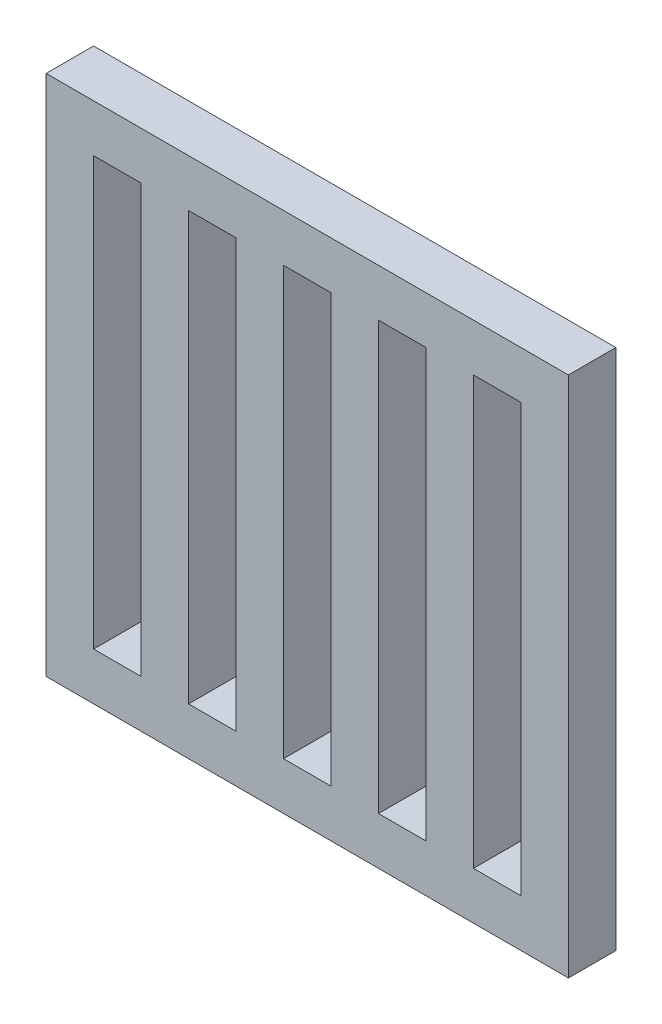
ISO-10303-21;
HEADER;
FILE_DESCRIPTION(('STEP AP214'),'2;1');
FILE_NAME('part.step','',(''),(''),'','','');
FILE_SCHEMA(('AUTOMOTIVE_DESIGN { 1 0 10303 214 1 1 1 1 }'));
ENDSEC;
DATA;
#1=APPLICATION_CONTEXT('core data for automotive mechanical design processes');
#2=APPLICATION_PROTOCOL_DEFINITION('international standard','automotive_design',2000,#1);
#3=PRODUCT_CONTEXT('',#1,'mechanical');
#4=PRODUCT('Part','Part','',(#3));
#5=PRODUCT_RELATED_PRODUCT_CATEGORY('part','',(#4));
#6=PRODUCT_DEFINITION_FORMATION('','',#4);
#7=PRODUCT_DEFINITION_CONTEXT('part definition',#1,'design');
#8=PRODUCT_DEFINITION('design','',#6,#7);
#9=PRODUCT_DEFINITION_SHAPE('','',#8);
#10=(LENGTH_UNIT() NAMED_UNIT(*) SI_UNIT(.MILLI.,.METRE.));
#11=(NAMED_UNIT(*) PLANE_ANGLE_UNIT() SI_UNIT($,.RADIAN.));
#12=(NAMED_UNIT(*) SI_UNIT($,.STERADIAN.) SOLID_ANGLE_UNIT());
#13=UNCERTAINTY_MEASURE_WITH_UNIT(LENGTH_MEASURE(1.E-05),#10,'distance_accuracy_value','');
#14=(GEOMETRIC_REPRESENTATION_CONTEXT(3) GLOBAL_UNCERTAINTY_ASSIGNED_CONTEXT((#13)) GLOBAL_UNIT_ASSIGNED_CONTEXT((#10,
#11,#12)) REPRESENTATION_CONTEXT('',''));
#15=CARTESIAN_POINT('',(0.,0.,0.));
#16=DIRECTION('',(0.,0.,1.));
#17=DIRECTION('',(1.,0.,0.));
#18=AXIS2_PLACEMENT_3D('',#15,#16,#17);
#19=CARTESIAN_POINT('',(0.,0.,50.));
#20=DIRECTION('',(1.,0.,0.));
#21=DIRECTION('',(0.,1.,0.));
#22=AXIS2_PLACEMENT_3D('',#19,#20,#21);
#23=PLANE('',#22);
#24=DIRECTION('',(0.,-1.,0.));
#25=VECTOR('',#24,1.);
#26=CARTESIAN_POINT('',(0.,0.,0.));
#27=LINE('',#26,#25);
#28=CARTESIAN_POINT('',(0.,0.,0.));
#29=VERTEX_POINT('',#28);
#30=CARTESIAN_POINT('',(0.,-550.,0.));
#31=VERTEX_POINT('',#30);
#32=EDGE_CURVE('E233',#29,#31,#27,.T.);
#33=ORIENTED_EDGE('',*,*,#32,.T.);
#34=DIRECTION('',(0.,0.,-1.));
#35=VECTOR('',#34,1.);
#36=CARTESIAN_POINT('',(0.,-550.,50.));
#37=LINE('',#36,#35);
#38=CARTESIAN_POINT('',(0.,-550.,50.));
#39=VERTEX_POINT('',#38);
#40=EDGE_CURVE('E11',#39,#31,#37,.T.);
#41=ORIENTED_EDGE('',*,*,#40,.F.);
#42=DIRECTION('',(0.,-1.,0.));
#43=VECTOR('',#42,1.);
#44=CARTESIAN_POINT('',(0.,0.,50.));
#45=LINE('',#44,#43);
#46=CARTESIAN_POINT('',(0.,0.,50.));
#47=VERTEX_POINT('',#46);
#48=EDGE_CURVE('E362',#47,#39,#45,.T.);
#49=ORIENTED_EDGE('',*,*,#48,.F.);
#50=DIRECTION('',(0.,0.,-1.));
#51=VECTOR('',#50,1.);
#52=CARTESIAN_POINT('',(0.,0.,50.));
#53=LINE('',#52,#51);
#54=EDGE_CURVE('E372',#47,#29,#53,.T.);
#55=ORIENTED_EDGE('',*,*,#54,.T.);
#56=EDGE_LOOP('',(#33,#41,#49,#55));
#57=FACE_BOUND('',#56,.T.);
#58=ADVANCED_FACE('F36',(#57),#23,.F.);
#59=CARTESIAN_POINT('',(0.,-550.,50.));
#60=DIRECTION('',(0.,1.,0.));
#61=DIRECTION('',(-1.,0.,0.));
#62=AXIS2_PLACEMENT_3D('',#59,#60,#61);
#63=PLANE('',#62);
#64=DIRECTION('',(1.,0.,0.));
#65=VECTOR('',#64,1.);
#66=CARTESIAN_POINT('',(0.,-550.,0.));
#67=LINE('',#66,#65);
#68=CARTESIAN_POINT('',(550.,-550.,0.));
#69=VERTEX_POINT('',#68);
#70=EDGE_CURVE('E375',#31,#69,#67,.T.);
#71=ORIENTED_EDGE('',*,*,#70,.T.);
#72=DIRECTION('',(0.,0.,-1.));
#73=VECTOR('',#72,1.);
#74=CARTESIAN_POINT('',(550.,-550.,50.));
#75=LINE('',#74,#73);
#76=CARTESIAN_POINT('',(550.,-550.,50.));
#77=VERTEX_POINT('',#76);
#78=EDGE_CURVE('E43',#77,#69,#75,.T.);
#79=ORIENTED_EDGE('',*,*,#78,.F.);
#80=DIRECTION('',(1.,0.,0.));
#81=VECTOR('',#80,1.);
#82=CARTESIAN_POINT('',(0.,-550.,50.));
#83=LINE('',#82,#81);
#84=EDGE_CURVE('E365',#39,#77,#83,.T.);
#85=ORIENTED_EDGE('',*,*,#84,.F.);
#86=ORIENTED_EDGE('',*,*,#40,.T.);
#87=EDGE_LOOP('',(#71,#79,#85,#86));
#88=FACE_BOUND('',#87,.T.);
#89=ADVANCED_FACE('F404',(#88),#63,.F.);
#90=CARTESIAN_POINT('',(550.,0.,50.));
#91=DIRECTION('',(-1.,0.,0.));
#92=DIRECTION('',(0.,-1.,0.));
#93=AXIS2_PLACEMENT_3D('',#90,#91,#92);
#94=PLANE('',#93);
#95=DIRECTION('',(0.,1.,0.));
#96=VECTOR('',#95,1.);
#97=CARTESIAN_POINT('',(550.,0.,0.));
#98=LINE('',#97,#96);
#99=CARTESIAN_POINT('',(550.,0.,0.));
#100=VERTEX_POINT('',#99);
#101=EDGE_CURVE('E377',#69,#100,#98,.T.);
#102=ORIENTED_EDGE('',*,*,#101,.T.);
#103=DIRECTION('',(0.,0.,-1.));
#104=VECTOR('',#103,1.);
#105=CARTESIAN_POINT('',(550.,0.,50.));
#106=LINE('',#105,#104);
#107=CARTESIAN_POINT('',(550.,0.,50.));
#108=VERTEX_POINT('',#107);
#109=EDGE_CURVE('E382',#108,#100,#106,.T.);
#110=ORIENTED_EDGE('',*,*,#109,.F.);
#111=DIRECTION('',(0.,1.,0.));
#112=VECTOR('',#111,1.);
#113=CARTESIAN_POINT('',(550.,0.,50.));
#114=LINE('',#113,#112);
#115=EDGE_CURVE('E368',#77,#108,#114,.T.);
#116=ORIENTED_EDGE('',*,*,#115,.F.);
#117=ORIENTED_EDGE('',*,*,#78,.T.);
#118=EDGE_LOOP('',(#102,#110,#116,#117));
#119=FACE_BOUND('',#118,.T.);
#120=ADVANCED_FACE('F389',(#119),#94,.F.);
#121=CARTESIAN_POINT('',(0.,0.,50.));
#122=DIRECTION('',(0.,-1.,0.));
#123=DIRECTION('',(0.,0.,-1.));
#124=AXIS2_PLACEMENT_3D('',#121,#122,#123);
#125=PLANE('',#124);
#126=DIRECTION('',(-1.,0.,0.));
#127=VECTOR('',#126,1.);
#128=CARTESIAN_POINT('',(0.,0.,0.));
#129=LINE('',#128,#127);
#130=EDGE_CURVE('E366',#100,#29,#129,.T.);
#131=ORIENTED_EDGE('',*,*,#130,.T.);
#132=ORIENTED_EDGE('',*,*,#54,.F.);
#133=DIRECTION('',(-1.,0.,0.));
#134=VECTOR('',#133,1.);
#135=CARTESIAN_POINT('',(0.,0.,50.));
#136=LINE('',#135,#134);
#137=EDGE_CURVE('E370',#108,#47,#136,.T.);
#138=ORIENTED_EDGE('',*,*,#137,.F.);
#139=ORIENTED_EDGE('',*,*,#109,.T.);
#140=EDGE_LOOP('',(#131,#132,#138,#139));
#141=FACE_BOUND('',#140,.T.);
#142=ADVANCED_FACE('F397',(#141),#125,.F.);
#143=CARTESIAN_POINT('',(0.,0.,50.));
#144=DIRECTION('',(0.,0.,1.));
#145=DIRECTION('',(1.,0.,0.));
#146=AXIS2_PLACEMENT_3D('',#143,#144,#145);
#147=PLANE('',#146);
#148=DIRECTION('',(0.,-1.,0.));
#149=VECTOR('',#148,1.);
#150=CARTESIAN_POINT('',(50.0000000000001,-50.,50.));
#151=LINE('',#150,#149);
#152=CARTESIAN_POINT('',(50.0000000000001,-50.,50.));
#153=VERTEX_POINT('',#152);
#154=CARTESIAN_POINT('',(50.0000000000001,-500.,50.));
#155=VERTEX_POINT('',#154);
#156=EDGE_CURVE('E50',#153,#155,#151,.T.);
#157=ORIENTED_EDGE('',*,*,#156,.F.);
#158=DIRECTION('',(-1.,0.,0.));
#159=VECTOR('',#158,1.);
#160=CARTESIAN_POINT('',(50.0000000000001,-50.,50.));
#161=LINE('',#160,#159);
#162=CARTESIAN_POINT('',(100.,-50.,50.));
#163=VERTEX_POINT('',#162);
#164=EDGE_CURVE('E217',#163,#153,#161,.T.);
#165=ORIENTED_EDGE('',*,*,#164,.F.);
#166=DIRECTION('',(0.,1.,0.));
#167=VECTOR('',#166,1.);
#168=CARTESIAN_POINT('',(100.,-50.,50.));
#169=LINE('',#168,#167);
#170=CARTESIAN_POINT('',(100.,-500.,50.));
#171=VERTEX_POINT('',#170);
#172=EDGE_CURVE('E220',#171,#163,#169,.T.);
#173=ORIENTED_EDGE('',*,*,#172,.F.);
#174=DIRECTION('',(1.,0.,0.));
#175=VECTOR('',#174,1.);
#176=CARTESIAN_POINT('',(50.0000000000001,-500.,50.));
#177=LINE('',#176,#175);
#178=EDGE_CURVE('E226',#155,#171,#177,.T.);
#179=ORIENTED_EDGE('',*,*,#178,.F.);
#180=EDGE_LOOP('',(#157,#165,#173,#179));
#181=FACE_BOUND('',#180,.T.);
#182=DIRECTION('',(0.,-1.,0.));
#183=VECTOR('',#182,1.);
#184=CARTESIAN_POINT('',(150.,-50.,50.));
#185=LINE('',#184,#183);
#186=CARTESIAN_POINT('',(150.,-50.,50.));
#187=VERTEX_POINT('',#186);
#188=CARTESIAN_POINT('',(150.,-500.,50.));
#189=VERTEX_POINT('',#188);
#190=EDGE_CURVE('E58',#187,#189,#185,.T.);
#191=ORIENTED_EDGE('',*,*,#190,.F.);
#192=DIRECTION('',(-1.,0.,0.));
#193=VECTOR('',#192,1.);
#194=CARTESIAN_POINT('',(150.,-50.,50.));
#195=LINE('',#194,#193);
#196=CARTESIAN_POINT('',(200.,-50.,50.));
#197=VERTEX_POINT('',#196);
#198=EDGE_CURVE('E241',#197,#187,#195,.T.);
#199=ORIENTED_EDGE('',*,*,#198,.F.);
#200=DIRECTION('',(0.,1.,0.));
#201=VECTOR('',#200,1.);
#202=CARTESIAN_POINT('',(200.,-50.,50.));
#203=LINE('',#202,#201);
#204=CARTESIAN_POINT('',(200.,-500.,50.));
#205=VERTEX_POINT('',#204);
#206=EDGE_CURVE('E256',#205,#197,#203,.T.);
#207=ORIENTED_EDGE('',*,*,#206,.F.);
#208=DIRECTION('',(1.,0.,0.));
#209=VECTOR('',#208,1.);
#210=CARTESIAN_POINT('',(150.,-500.,50.));
#211=LINE('',#210,#209);
#212=EDGE_CURVE('E252',#189,#205,#211,.T.);
#213=ORIENTED_EDGE('',*,*,#212,.F.);
#214=EDGE_LOOP('',(#191,#199,#207,#213));
#215=FACE_BOUND('',#214,.T.);
#216=DIRECTION('',(0.,-1.,0.));
#217=VECTOR('',#216,1.);
#218=CARTESIAN_POINT('',(250.,-50.,50.));
#219=LINE('',#218,#217);
#220=CARTESIAN_POINT('',(250.,-50.,50.));
#221=VERTEX_POINT('',#220);
#222=CARTESIAN_POINT('',(250.,-500.,50.));
#223=VERTEX_POINT('',#222);
#224=EDGE_CURVE('E281',#221,#223,#219,.T.);
#225=ORIENTED_EDGE('',*,*,#224,.F.);
#226=DIRECTION('',(-1.,0.,0.));
#227=VECTOR('',#226,1.);
#228=CARTESIAN_POINT('',(250.,-50.,50.));
#229=LINE('',#228,#227);
#230=CARTESIAN_POINT('',(300.,-50.,50.));
#231=VERTEX_POINT('',#230);
#232=EDGE_CURVE('E271',#231,#221,#229,.T.);
#233=ORIENTED_EDGE('',*,*,#232,.F.);
#234=DIRECTION('',(0.,1.,0.));
#235=VECTOR('',#234,1.);
#236=CARTESIAN_POINT('',(300.,-50.,50.));
#237=LINE('',#236,#235);
#238=CARTESIAN_POINT('',(300.,-500.,50.));
#239=VERTEX_POINT('',#238);
#240=EDGE_CURVE('E287',#239,#231,#237,.T.);
#241=ORIENTED_EDGE('',*,*,#240,.F.);
#242=DIRECTION('',(1.,0.,0.));
#243=VECTOR('',#242,1.);
#244=CARTESIAN_POINT('',(250.,-500.,50.));
#245=LINE('',#244,#243);
#246=EDGE_CURVE('E283',#223,#239,#245,.T.);
#247=ORIENTED_EDGE('',*,*,#246,.F.);
#248=EDGE_LOOP('',(#225,#233,#241,#247));
#249=FACE_BOUND('',#248,.T.);
#250=DIRECTION('',(0.,-1.,0.));
#251=VECTOR('',#250,1.);
#252=CARTESIAN_POINT('',(350.,-50.,50.));
#253=LINE('',#252,#251);
#254=CARTESIAN_POINT('',(350.,-50.,50.));
#255=VERTEX_POINT('',#254);
#256=CARTESIAN_POINT('',(350.,-500.,50.));
#257=VERTEX_POINT('',#256);
#258=EDGE_CURVE('E313',#255,#257,#253,.T.);
#259=ORIENTED_EDGE('',*,*,#258,.F.);
#260=DIRECTION('',(-1.,0.,0.));
#261=VECTOR('',#260,1.);
#262=CARTESIAN_POINT('',(350.,-50.,50.));
#263=LINE('',#262,#261);
#264=CARTESIAN_POINT('',(400.,-50.,50.));
#265=VERTEX_POINT('',#264);
#266=EDGE_CURVE('E303',#265,#255,#263,.T.);
#267=ORIENTED_EDGE('',*,*,#266,.F.);
#268=DIRECTION('',(0.,1.,0.));
#269=VECTOR('',#268,1.);
#270=CARTESIAN_POINT('',(400.,-50.,50.));
#271=LINE('',#270,#269);
#272=CARTESIAN_POINT('',(400.,-500.,50.));
#273=VERTEX_POINT('',#272);
#274=EDGE_CURVE('E319',#273,#265,#271,.T.);
#275=ORIENTED_EDGE('',*,*,#274,.F.);
#276=DIRECTION('',(1.,0.,0.));
#277=VECTOR('',#276,1.);
#278=CARTESIAN_POINT('',(350.,-500.,50.));
#279=LINE('',#278,#277);
#280=EDGE_CURVE('E315',#257,#273,#279,.T.);
#281=ORIENTED_EDGE('',*,*,#280,.F.);
#282=EDGE_LOOP('',(#259,#267,#275,#281));
#283=FACE_BOUND('',#282,.T.);
#284=DIRECTION('',(0.,-1.,0.));
#285=VECTOR('',#284,1.);
#286=CARTESIAN_POINT('',(450.,-50.,50.));
#287=LINE('',#286,#285);
#288=CARTESIAN_POINT('',(450.,-50.,50.));
#289=VERTEX_POINT('',#288);
#290=CARTESIAN_POINT('',(450.,-500.,50.));
#291=VERTEX_POINT('',#290);
#292=EDGE_CURVE('E345',#289,#291,#287,.T.);
#293=ORIENTED_EDGE('',*,*,#292,.F.);
#294=DIRECTION('',(-1.,0.,0.));
#295=VECTOR('',#294,1.);
#296=CARTESIAN_POINT('',(450.,-50.,50.));
#297=LINE('',#296,#295);
#298=CARTESIAN_POINT('',(500.,-50.,50.));
#299=VERTEX_POINT('',#298);
#300=EDGE_CURVE('E335',#299,#289,#297,.T.);
#301=ORIENTED_EDGE('',*,*,#300,.F.);
#302=DIRECTION('',(0.,1.,0.));
#303=VECTOR('',#302,1.);
#304=CARTESIAN_POINT('',(500.,-50.,50.));
#305=LINE('',#304,#303);
#306=CARTESIAN_POINT('',(500.,-500.,50.));
#307=VERTEX_POINT('',#306);
#308=EDGE_CURVE('E350',#307,#299,#305,.T.);
#309=ORIENTED_EDGE('',*,*,#308,.F.);
#310=DIRECTION('',(1.,0.,0.));
#311=VECTOR('',#310,1.);
#312=CARTESIAN_POINT('',(450.,-500.,50.));
#313=LINE('',#312,#311);
#314=EDGE_CURVE('E347',#291,#307,#313,.T.);
#315=ORIENTED_EDGE('',*,*,#314,.F.);
#316=EDGE_LOOP('',(#293,#301,#309,#315));
#317=FACE_BOUND('',#316,.T.);
#318=ORIENTED_EDGE('',*,*,#48,.T.);
#319=ORIENTED_EDGE('',*,*,#84,.T.);
#320=ORIENTED_EDGE('',*,*,#115,.T.);
#321=ORIENTED_EDGE('',*,*,#137,.T.);
#322=EDGE_LOOP('',(#318,#319,#320,#321));
#323=FACE_BOUND('',#322,.T.);
#324=ADVANCED_FACE('F403',(#181,#215,#249,#283,#317,#323),#147,.T.);
#325=CARTESIAN_POINT('',(0.,0.,0.));
#326=DIRECTION('',(0.,0.,1.));
#327=DIRECTION('',(1.,0.,0.));
#328=AXIS2_PLACEMENT_3D('',#325,#326,#327);
#329=PLANE('',#328);
#330=DIRECTION('',(-1.,0.,0.));
#331=VECTOR('',#330,1.);
#332=CARTESIAN_POINT('',(50.0000000000001,-50.,0.));
#333=LINE('',#332,#331);
#334=CARTESIAN_POINT('',(100.,-50.,0.));
#335=VERTEX_POINT('',#334);
#336=CARTESIAN_POINT('',(50.0000000000001,-50.,0.));
#337=VERTEX_POINT('',#336);
#338=EDGE_CURVE('E204',#335,#337,#333,.T.);
#339=ORIENTED_EDGE('',*,*,#338,.T.);
#340=DIRECTION('',(0.,-1.,0.));
#341=VECTOR('',#340,1.);
#342=CARTESIAN_POINT('',(50.0000000000001,-50.,0.));
#343=LINE('',#342,#341);
#344=CARTESIAN_POINT('',(50.0000000000001,-500.,0.));
#345=VERTEX_POINT('',#344);
#346=EDGE_CURVE('E198',#337,#345,#343,.T.);
#347=ORIENTED_EDGE('',*,*,#346,.T.);
#348=DIRECTION('',(1.,0.,0.));
#349=VECTOR('',#348,1.);
#350=CARTESIAN_POINT('',(50.0000000000001,-500.,0.));
#351=LINE('',#350,#349);
#352=CARTESIAN_POINT('',(100.,-500.,0.));
#353=VERTEX_POINT('',#352);
#354=EDGE_CURVE('E208',#345,#353,#351,.T.);
#355=ORIENTED_EDGE('',*,*,#354,.T.);
#356=DIRECTION('',(0.,1.,0.));
#357=VECTOR('',#356,1.);
#358=CARTESIAN_POINT('',(100.,-50.,0.));
#359=LINE('',#358,#357);
#360=EDGE_CURVE('E212',#353,#335,#359,.T.);
#361=ORIENTED_EDGE('',*,*,#360,.T.);
#362=EDGE_LOOP('',(#339,#347,#355,#361));
#363=FACE_BOUND('',#362,.T.);
#364=DIRECTION('',(-1.,0.,0.));
#365=VECTOR('',#364,1.);
#366=CARTESIAN_POINT('',(150.,-50.,0.));
#367=LINE('',#366,#365);
#368=CARTESIAN_POINT('',(200.,-50.,0.));
#369=VERTEX_POINT('',#368);
#370=CARTESIAN_POINT('',(150.,-50.,0.));
#371=VERTEX_POINT('',#370);
#372=EDGE_CURVE('E247',#369,#371,#367,.T.);
#373=ORIENTED_EDGE('',*,*,#372,.T.);
#374=DIRECTION('',(0.,-1.,0.));
#375=VECTOR('',#374,1.);
#376=CARTESIAN_POINT('',(150.,-50.,0.));
#377=LINE('',#376,#375);
#378=CARTESIAN_POINT('',(150.,-500.,0.));
#379=VERTEX_POINT('',#378);
#380=EDGE_CURVE('E237',#371,#379,#377,.T.);
#381=ORIENTED_EDGE('',*,*,#380,.T.);
#382=DIRECTION('',(1.,0.,0.));
#383=VECTOR('',#382,1.);
#384=CARTESIAN_POINT('',(150.,-500.,0.));
#385=LINE('',#384,#383);
#386=CARTESIAN_POINT('',(200.,-500.,0.));
#387=VERTEX_POINT('',#386);
#388=EDGE_CURVE('E240',#379,#387,#385,.T.);
#389=ORIENTED_EDGE('',*,*,#388,.T.);
#390=DIRECTION('',(0.,1.,0.));
#391=VECTOR('',#390,1.);
#392=CARTESIAN_POINT('',(200.,-50.,0.));
#393=LINE('',#392,#391);
#394=EDGE_CURVE('E244',#387,#369,#393,.T.);
#395=ORIENTED_EDGE('',*,*,#394,.T.);
#396=EDGE_LOOP('',(#373,#381,#389,#395));
#397=FACE_BOUND('',#396,.T.);
#398=DIRECTION('',(-1.,0.,0.));
#399=VECTOR('',#398,1.);
#400=CARTESIAN_POINT('',(250.,-50.,0.));
#401=LINE('',#400,#399);
#402=CARTESIAN_POINT('',(300.,-50.,0.));
#403=VERTEX_POINT('',#402);
#404=CARTESIAN_POINT('',(250.,-50.,0.));
#405=VERTEX_POINT('',#404);
#406=EDGE_CURVE('E277',#403,#405,#401,.T.);
#407=ORIENTED_EDGE('',*,*,#406,.T.);
#408=DIRECTION('',(0.,-1.,0.));
#409=VECTOR('',#408,1.);
#410=CARTESIAN_POINT('',(250.,-50.,0.));
#411=LINE('',#410,#409);
#412=CARTESIAN_POINT('',(250.,-500.,0.));
#413=VERTEX_POINT('',#412);
#414=EDGE_CURVE('E267',#405,#413,#411,.T.);
#415=ORIENTED_EDGE('',*,*,#414,.T.);
#416=DIRECTION('',(1.,0.,0.));
#417=VECTOR('',#416,1.);
#418=CARTESIAN_POINT('',(250.,-500.,0.));
#419=LINE('',#418,#417);
#420=CARTESIAN_POINT('',(300.,-500.,0.));
#421=VERTEX_POINT('',#420);
#422=EDGE_CURVE('E270',#413,#421,#419,.T.);
#423=ORIENTED_EDGE('',*,*,#422,.T.);
#424=DIRECTION('',(0.,1.,0.));
#425=VECTOR('',#424,1.);
#426=CARTESIAN_POINT('',(300.,-50.,0.));
#427=LINE('',#426,#425);
#428=EDGE_CURVE('E274',#421,#403,#427,.T.);
#429=ORIENTED_EDGE('',*,*,#428,.T.);
#430=EDGE_LOOP('',(#407,#415,#423,#429));
#431=FACE_BOUND('',#430,.T.);
#432=DIRECTION('',(-1.,0.,0.));
#433=VECTOR('',#432,1.);
#434=CARTESIAN_POINT('',(350.,-50.,0.));
#435=LINE('',#434,#433);
#436=CARTESIAN_POINT('',(400.,-50.,0.));
#437=VERTEX_POINT('',#436);
#438=CARTESIAN_POINT('',(350.,-50.,0.));
#439=VERTEX_POINT('',#438);
#440=EDGE_CURVE('E309',#437,#439,#435,.T.);
#441=ORIENTED_EDGE('',*,*,#440,.T.);
#442=DIRECTION('',(0.,-1.,0.));
#443=VECTOR('',#442,1.);
#444=CARTESIAN_POINT('',(350.,-50.,0.));
#445=LINE('',#444,#443);
#446=CARTESIAN_POINT('',(350.,-500.,0.));
#447=VERTEX_POINT('',#446);
#448=EDGE_CURVE('E299',#439,#447,#445,.T.);
#449=ORIENTED_EDGE('',*,*,#448,.T.);
#450=DIRECTION('',(1.,0.,0.));
#451=VECTOR('',#450,1.);
#452=CARTESIAN_POINT('',(350.,-500.,0.));
#453=LINE('',#452,#451);
#454=CARTESIAN_POINT('',(400.,-500.,0.));
#455=VERTEX_POINT('',#454);
#456=EDGE_CURVE('E302',#447,#455,#453,.T.);
#457=ORIENTED_EDGE('',*,*,#456,.T.);
#458=DIRECTION('',(0.,1.,0.));
#459=VECTOR('',#458,1.);
#460=CARTESIAN_POINT('',(400.,-50.,0.));
#461=LINE('',#460,#459);
#462=EDGE_CURVE('E306',#455,#437,#461,.T.);
#463=ORIENTED_EDGE('',*,*,#462,.T.);
#464=EDGE_LOOP('',(#441,#449,#457,#463));
#465=FACE_BOUND('',#464,.T.);
#466=DIRECTION('',(-1.,0.,0.));
#467=VECTOR('',#466,1.);
#468=CARTESIAN_POINT('',(450.,-50.,0.));
#469=LINE('',#468,#467);
#470=CARTESIAN_POINT('',(500.,-50.,0.));
#471=VERTEX_POINT('',#470);
#472=CARTESIAN_POINT('',(450.,-50.,0.));
#473=VERTEX_POINT('',#472);
#474=EDGE_CURVE('E341',#471,#473,#469,.T.);
#475=ORIENTED_EDGE('',*,*,#474,.T.);
#476=DIRECTION('',(0.,-1.,0.));
#477=VECTOR('',#476,1.);
#478=CARTESIAN_POINT('',(450.,-50.,0.));
#479=LINE('',#478,#477);
#480=CARTESIAN_POINT('',(450.,-500.,0.));
#481=VERTEX_POINT('',#480);
#482=EDGE_CURVE('E331',#473,#481,#479,.T.);
#483=ORIENTED_EDGE('',*,*,#482,.T.);
#484=DIRECTION('',(1.,0.,0.));
#485=VECTOR('',#484,1.);
#486=CARTESIAN_POINT('',(450.,-500.,0.));
#487=LINE('',#486,#485);
#488=CARTESIAN_POINT('',(500.,-500.,0.));
#489=VERTEX_POINT('',#488);
#490=EDGE_CURVE('E334',#481,#489,#487,.T.);
#491=ORIENTED_EDGE('',*,*,#490,.T.);
#492=DIRECTION('',(0.,1.,0.));
#493=VECTOR('',#492,1.);
#494=CARTESIAN_POINT('',(500.,-50.,0.));
#495=LINE('',#494,#493);
#496=EDGE_CURVE('E338',#489,#471,#495,.T.);
#497=ORIENTED_EDGE('',*,*,#496,.T.);
#498=EDGE_LOOP('',(#475,#483,#491,#497));
#499=FACE_BOUND('',#498,.T.);
#500=ORIENTED_EDGE('',*,*,#32,.F.);
#501=ORIENTED_EDGE('',*,*,#130,.F.);
#502=ORIENTED_EDGE('',*,*,#101,.F.);
#503=ORIENTED_EDGE('',*,*,#70,.F.);
#504=EDGE_LOOP('',(#500,#501,#502,#503));
#505=FACE_BOUND('',#504,.T.);
#506=ADVANCED_FACE('F214',(#363,#397,#431,#465,#499,#505),#329,.F.);
#507=CARTESIAN_POINT('',(450.,-50.,0.));
#508=DIRECTION('',(-1.,0.,0.));
#509=DIRECTION('',(0.,-1.,0.));
#510=AXIS2_PLACEMENT_3D('',#507,#508,#509);
#511=PLANE('',#510);
#512=ORIENTED_EDGE('',*,*,#292,.T.);
#513=DIRECTION('',(0.,0.,1.));
#514=VECTOR('',#513,1.);
#515=CARTESIAN_POINT('',(450.,-500.,0.));
#516=LINE('',#515,#514);
#517=EDGE_CURVE('E344',#481,#291,#516,.T.);
#518=ORIENTED_EDGE('',*,*,#517,.F.);
#519=ORIENTED_EDGE('',*,*,#482,.F.);
#520=DIRECTION('',(0.,0.,1.));
#521=VECTOR('',#520,1.);
#522=CARTESIAN_POINT('',(450.,-50.,0.));
#523=LINE('',#522,#521);
#524=EDGE_CURVE('E316',#473,#289,#523,.T.);
#525=ORIENTED_EDGE('',*,*,#524,.T.);
#526=EDGE_LOOP('',(#512,#518,#519,#525));
#527=FACE_BOUND('',#526,.T.);
#528=ADVANCED_FACE('F416',(#527),#511,.F.);
#529=CARTESIAN_POINT('',(450.,-50.,0.));
#530=DIRECTION('',(0.,1.,0.));
#531=DIRECTION('',(0.,0.,1.));
#532=AXIS2_PLACEMENT_3D('',#529,#530,#531);
#533=PLANE('',#532);
#534=ORIENTED_EDGE('',*,*,#300,.T.);
#535=ORIENTED_EDGE('',*,*,#524,.F.);
#536=ORIENTED_EDGE('',*,*,#474,.F.);
#537=DIRECTION('',(0.,0.,1.));
#538=VECTOR('',#537,1.);
#539=CARTESIAN_POINT('',(500.,-50.,0.));
#540=LINE('',#539,#538);
#541=EDGE_CURVE('E356',#471,#299,#540,.T.);
#542=ORIENTED_EDGE('',*,*,#541,.T.);
#543=EDGE_LOOP('',(#534,#535,#536,#542));
#544=FACE_BOUND('',#543,.T.);
#545=ADVANCED_FACE('F422',(#544),#533,.F.);
#546=CARTESIAN_POINT('',(500.,-50.,0.));
#547=DIRECTION('',(1.,0.,0.));
#548=DIRECTION('',(0.,0.,-1.));
#549=AXIS2_PLACEMENT_3D('',#546,#547,#548);
#550=PLANE('',#549);
#551=ORIENTED_EDGE('',*,*,#308,.T.);
#552=ORIENTED_EDGE('',*,*,#541,.F.);
#553=ORIENTED_EDGE('',*,*,#496,.F.);
#554=DIRECTION('',(0.,0.,1.));
#555=VECTOR('',#554,1.);
#556=CARTESIAN_POINT('',(500.,-500.,0.));
#557=LINE('',#556,#555);
#558=EDGE_CURVE('E358',#489,#307,#557,.T.);
#559=ORIENTED_EDGE('',*,*,#558,.T.);
#560=EDGE_LOOP('',(#551,#552,#553,#559));
#561=FACE_BOUND('',#560,.T.);
#562=ADVANCED_FACE('F428',(#561),#550,.F.);
#563=CARTESIAN_POINT('',(450.,-500.,0.));
#564=DIRECTION('',(0.,-1.,0.));
#565=DIRECTION('',(0.,0.,-1.));
#566=AXIS2_PLACEMENT_3D('',#563,#564,#565);
#567=PLANE('',#566);
#568=ORIENTED_EDGE('',*,*,#314,.T.);
#569=ORIENTED_EDGE('',*,*,#558,.F.);
#570=ORIENTED_EDGE('',*,*,#490,.F.);
#571=ORIENTED_EDGE('',*,*,#517,.T.);
#572=EDGE_LOOP('',(#568,#569,#570,#571));
#573=FACE_BOUND('',#572,.T.);
#574=ADVANCED_FACE('F424',(#573),#567,.F.);
#575=CARTESIAN_POINT('',(350.,-50.,0.));
#576=DIRECTION('',(-1.,0.,0.));
#577=DIRECTION('',(0.,-1.,0.));
#578=AXIS2_PLACEMENT_3D('',#575,#576,#577);
#579=PLANE('',#578);
#580=ORIENTED_EDGE('',*,*,#258,.T.);
#581=DIRECTION('',(0.,0.,1.));
#582=VECTOR('',#581,1.);
#583=CARTESIAN_POINT('',(350.,-500.,0.));
#584=LINE('',#583,#582);
#585=EDGE_CURVE('E312',#447,#257,#584,.T.);
#586=ORIENTED_EDGE('',*,*,#585,.F.);
#587=ORIENTED_EDGE('',*,*,#448,.F.);
#588=DIRECTION('',(0.,0.,1.));
#589=VECTOR('',#588,1.);
#590=CARTESIAN_POINT('',(350.,-50.,0.));
#591=LINE('',#590,#589);
#592=EDGE_CURVE('E284',#439,#255,#591,.T.);
#593=ORIENTED_EDGE('',*,*,#592,.T.);
#594=EDGE_LOOP('',(#580,#586,#587,#593));
#595=FACE_BOUND('',#594,.T.);
#596=ADVANCED_FACE('F427',(#595),#579,.F.);
#597=CARTESIAN_POINT('',(350.,-50.,0.));
#598=DIRECTION('',(0.,1.,0.));
#599=DIRECTION('',(0.,0.,1.));
#600=AXIS2_PLACEMENT_3D('',#597,#598,#599);
#601=PLANE('',#600);
#602=ORIENTED_EDGE('',*,*,#266,.T.);
#603=ORIENTED_EDGE('',*,*,#592,.F.);
#604=ORIENTED_EDGE('',*,*,#440,.F.);
#605=DIRECTION('',(0.,0.,1.));
#606=VECTOR('',#605,1.);
#607=CARTESIAN_POINT('',(400.,-50.,0.));
#608=LINE('',#607,#606);
#609=EDGE_CURVE('E325',#437,#265,#608,.T.);
#610=ORIENTED_EDGE('',*,*,#609,.T.);
#611=EDGE_LOOP('',(#602,#603,#604,#610));
#612=FACE_BOUND('',#611,.T.);
#613=ADVANCED_FACE('F438',(#612),#601,.F.);
#614=CARTESIAN_POINT('',(400.,-50.,0.));
#615=DIRECTION('',(1.,0.,0.));
#616=DIRECTION('',(0.,1.,0.));
#617=AXIS2_PLACEMENT_3D('',#614,#615,#616);
#618=PLANE('',#617);
#619=ORIENTED_EDGE('',*,*,#274,.T.);
#620=ORIENTED_EDGE('',*,*,#609,.F.);
#621=ORIENTED_EDGE('',*,*,#462,.F.);
#622=DIRECTION('',(0.,0.,1.));
#623=VECTOR('',#622,1.);
#624=CARTESIAN_POINT('',(400.,-500.,0.));
#625=LINE('',#624,#623);
#626=EDGE_CURVE('E327',#455,#273,#625,.T.);
#627=ORIENTED_EDGE('',*,*,#626,.T.);
#628=EDGE_LOOP('',(#619,#620,#621,#627));
#629=FACE_BOUND('',#628,.T.);
#630=ADVANCED_FACE('F444',(#629),#618,.F.);
#631=CARTESIAN_POINT('',(350.,-500.,0.));
#632=DIRECTION('',(0.,-1.,0.));
#633=DIRECTION('',(0.,0.,-1.));
#634=AXIS2_PLACEMENT_3D('',#631,#632,#633);
#635=PLANE('',#634);
#636=ORIENTED_EDGE('',*,*,#280,.T.);
#637=ORIENTED_EDGE('',*,*,#626,.F.);
#638=ORIENTED_EDGE('',*,*,#456,.F.);
#639=ORIENTED_EDGE('',*,*,#585,.T.);
#640=EDGE_LOOP('',(#636,#637,#638,#639));
#641=FACE_BOUND('',#640,.T.);
#642=ADVANCED_FACE('F440',(#641),#635,.F.);
#643=CARTESIAN_POINT('',(250.,-50.,0.));
#644=DIRECTION('',(-1.,0.,0.));
#645=DIRECTION('',(0.,-1.,0.));
#646=AXIS2_PLACEMENT_3D('',#643,#644,#645);
#647=PLANE('',#646);
#648=ORIENTED_EDGE('',*,*,#224,.T.);
#649=DIRECTION('',(0.,0.,1.));
#650=VECTOR('',#649,1.);
#651=CARTESIAN_POINT('',(250.,-500.,0.));
#652=LINE('',#651,#650);
#653=EDGE_CURVE('E280',#413,#223,#652,.T.);
#654=ORIENTED_EDGE('',*,*,#653,.F.);
#655=ORIENTED_EDGE('',*,*,#414,.F.);
#656=DIRECTION('',(0.,0.,1.));
#657=VECTOR('',#656,1.);
#658=CARTESIAN_POINT('',(250.,-50.,0.));
#659=LINE('',#658,#657);
#660=EDGE_CURVE('E253',#405,#221,#659,.T.);
#661=ORIENTED_EDGE('',*,*,#660,.T.);
#662=EDGE_LOOP('',(#648,#654,#655,#661));
#663=FACE_BOUND('',#662,.T.);
#664=ADVANCED_FACE('F443',(#663),#647,.F.);
#665=CARTESIAN_POINT('',(250.,-50.,0.));
#666=DIRECTION('',(0.,1.,0.));
#667=DIRECTION('',(0.,0.,1.));
#668=AXIS2_PLACEMENT_3D('',#665,#666,#667);
#669=PLANE('',#668);
#670=ORIENTED_EDGE('',*,*,#232,.T.);
#671=ORIENTED_EDGE('',*,*,#660,.F.);
#672=ORIENTED_EDGE('',*,*,#406,.F.);
#673=DIRECTION('',(0.,0.,1.));
#674=VECTOR('',#673,1.);
#675=CARTESIAN_POINT('',(300.,-50.,0.));
#676=LINE('',#675,#674);
#677=EDGE_CURVE('E293',#403,#231,#676,.T.);
#678=ORIENTED_EDGE('',*,*,#677,.T.);
#679=EDGE_LOOP('',(#670,#671,#672,#678));
#680=FACE_BOUND('',#679,.T.);
#681=ADVANCED_FACE('F454',(#680),#669,.F.);
#682=CARTESIAN_POINT('',(300.,-50.,0.));
#683=DIRECTION('',(1.,0.,0.));
#684=DIRECTION('',(0.,1.,0.));
#685=AXIS2_PLACEMENT_3D('',#682,#683,#684);
#686=PLANE('',#685);
#687=ORIENTED_EDGE('',*,*,#240,.T.);
#688=ORIENTED_EDGE('',*,*,#677,.F.);
#689=ORIENTED_EDGE('',*,*,#428,.F.);
#690=DIRECTION('',(0.,0.,1.));
#691=VECTOR('',#690,1.);
#692=CARTESIAN_POINT('',(300.,-500.,0.));
#693=LINE('',#692,#691);
#694=EDGE_CURVE('E295',#421,#239,#693,.T.);
#695=ORIENTED_EDGE('',*,*,#694,.T.);
#696=EDGE_LOOP('',(#687,#688,#689,#695));
#697=FACE_BOUND('',#696,.T.);
#698=ADVANCED_FACE('F460',(#697),#686,.F.);
#699=CARTESIAN_POINT('',(250.,-500.,0.));
#700=DIRECTION('',(0.,-1.,0.));
#701=DIRECTION('',(0.,0.,-1.));
#702=AXIS2_PLACEMENT_3D('',#699,#700,#701);
#703=PLANE('',#702);
#704=ORIENTED_EDGE('',*,*,#246,.T.);
#705=ORIENTED_EDGE('',*,*,#694,.F.);
#706=ORIENTED_EDGE('',*,*,#422,.F.);
#707=ORIENTED_EDGE('',*,*,#653,.T.);
#708=EDGE_LOOP('',(#704,#705,#706,#707));
#709=FACE_BOUND('',#708,.T.);
#710=ADVANCED_FACE('F456',(#709),#703,.F.);
#711=CARTESIAN_POINT('',(150.,-50.,0.));
#712=DIRECTION('',(-1.,0.,0.));
#713=DIRECTION('',(0.,-1.,0.));
#714=AXIS2_PLACEMENT_3D('',#711,#712,#713);
#715=PLANE('',#714);
#716=ORIENTED_EDGE('',*,*,#190,.T.);
#717=DIRECTION('',(0.,0.,1.));
#718=VECTOR('',#717,1.);
#719=CARTESIAN_POINT('',(150.,-500.,0.));
#720=LINE('',#719,#718);
#721=EDGE_CURVE('E250',#379,#189,#720,.T.);
#722=ORIENTED_EDGE('',*,*,#721,.F.);
#723=ORIENTED_EDGE('',*,*,#380,.F.);
#724=DIRECTION('',(0.,0.,1.));
#725=VECTOR('',#724,1.);
#726=CARTESIAN_POINT('',(150.,-50.,0.));
#727=LINE('',#726,#725);
#728=EDGE_CURVE('E227',#371,#187,#727,.T.);
#729=ORIENTED_EDGE('',*,*,#728,.T.);
#730=EDGE_LOOP('',(#716,#722,#723,#729));
#731=FACE_BOUND('',#730,.T.);
#732=ADVANCED_FACE('F459',(#731),#715,.F.);
#733=CARTESIAN_POINT('',(150.,-50.,0.));
#734=DIRECTION('',(0.,1.,0.));
#735=DIRECTION('',(0.,0.,1.));
#736=AXIS2_PLACEMENT_3D('',#733,#734,#735);
#737=PLANE('',#736);
#738=ORIENTED_EDGE('',*,*,#198,.T.);
#739=ORIENTED_EDGE('',*,*,#728,.F.);
#740=ORIENTED_EDGE('',*,*,#372,.F.);
#741=DIRECTION('',(0.,0.,1.));
#742=VECTOR('',#741,1.);
#743=CARTESIAN_POINT('',(200.,-50.,0.));
#744=LINE('',#743,#742);
#745=EDGE_CURVE('E262',#369,#197,#744,.T.);
#746=ORIENTED_EDGE('',*,*,#745,.T.);
#747=EDGE_LOOP('',(#738,#739,#740,#746));
#748=FACE_BOUND('',#747,.T.);
#749=ADVANCED_FACE('F470',(#748),#737,.F.);
#750=CARTESIAN_POINT('',(200.,-50.,0.));
#751=DIRECTION('',(1.,0.,0.));
#752=DIRECTION('',(0.,1.,0.));
#753=AXIS2_PLACEMENT_3D('',#750,#751,#752);
#754=PLANE('',#753);
#755=ORIENTED_EDGE('',*,*,#206,.T.);
#756=ORIENTED_EDGE('',*,*,#745,.F.);
#757=ORIENTED_EDGE('',*,*,#394,.F.);
#758=DIRECTION('',(0.,0.,1.));
#759=VECTOR('',#758,1.);
#760=CARTESIAN_POINT('',(200.,-500.,0.));
#761=LINE('',#760,#759);
#762=EDGE_CURVE('E264',#387,#205,#761,.T.);
#763=ORIENTED_EDGE('',*,*,#762,.T.);
#764=EDGE_LOOP('',(#755,#756,#757,#763));
#765=FACE_BOUND('',#764,.T.);
#766=ADVANCED_FACE('F474',(#765),#754,.F.);
#767=CARTESIAN_POINT('',(150.,-500.,0.));
#768=DIRECTION('',(0.,-1.,0.));
#769=DIRECTION('',(0.,0.,-1.));
#770=AXIS2_PLACEMENT_3D('',#767,#768,#769);
#771=PLANE('',#770);
#772=ORIENTED_EDGE('',*,*,#212,.T.);
#773=ORIENTED_EDGE('',*,*,#762,.F.);
#774=ORIENTED_EDGE('',*,*,#388,.F.);
#775=ORIENTED_EDGE('',*,*,#721,.T.);
#776=EDGE_LOOP('',(#772,#773,#774,#775));
#777=FACE_BOUND('',#776,.T.);
#778=ADVANCED_FACE('F471',(#777),#771,.F.);
#779=CARTESIAN_POINT('',(50.0000000000001,-50.,0.));
#780=DIRECTION('',(-1.,0.,0.));
#781=DIRECTION('',(0.,-1.,0.));
#782=AXIS2_PLACEMENT_3D('',#779,#780,#781);
#783=PLANE('',#782);
#784=ORIENTED_EDGE('',*,*,#156,.T.);
#785=DIRECTION('',(0.,0.,1.));
#786=VECTOR('',#785,1.);
#787=CARTESIAN_POINT('',(50.0000000000001,-500.,0.));
#788=LINE('',#787,#786);
#789=EDGE_CURVE('E194',#345,#155,#788,.T.);
#790=ORIENTED_EDGE('',*,*,#789,.F.);
#791=ORIENTED_EDGE('',*,*,#346,.F.);
#792=DIRECTION('',(0.,0.,1.));
#793=VECTOR('',#792,1.);
#794=CARTESIAN_POINT('',(50.0000000000001,-50.,0.));
#795=LINE('',#794,#793);
#796=EDGE_CURVE('E231',#337,#153,#795,.T.);
#797=ORIENTED_EDGE('',*,*,#796,.T.);
#798=EDGE_LOOP('',(#784,#790,#791,#797));
#799=FACE_BOUND('',#798,.T.);
#800=ADVANCED_FACE('F196',(#799),#783,.F.);
#801=CARTESIAN_POINT('',(50.0000000000001,-50.,0.));
#802=DIRECTION('',(0.,1.,0.));
#803=DIRECTION('',(0.,0.,1.));
#804=AXIS2_PLACEMENT_3D('',#801,#802,#803);
#805=PLANE('',#804);
#806=ORIENTED_EDGE('',*,*,#164,.T.);
#807=ORIENTED_EDGE('',*,*,#796,.F.);
#808=ORIENTED_EDGE('',*,*,#338,.F.);
#809=DIRECTION('',(0.,0.,1.));
#810=VECTOR('',#809,1.);
#811=CARTESIAN_POINT('',(100.,-50.,0.));
#812=LINE('',#811,#810);
#813=EDGE_CURVE('E234',#335,#163,#812,.T.);
#814=ORIENTED_EDGE('',*,*,#813,.T.);
#815=EDGE_LOOP('',(#806,#807,#808,#814));
#816=FACE_BOUND('',#815,.T.);
#817=ADVANCED_FACE('F484',(#816),#805,.F.);
#818=CARTESIAN_POINT('',(100.,-50.,0.));
#819=DIRECTION('',(1.,0.,0.));
#820=DIRECTION('',(0.,1.,0.));
#821=AXIS2_PLACEMENT_3D('',#818,#819,#820);
#822=PLANE('',#821);
#823=ORIENTED_EDGE('',*,*,#172,.T.);
#824=ORIENTED_EDGE('',*,*,#813,.F.);
#825=ORIENTED_EDGE('',*,*,#360,.F.);
#826=DIRECTION('',(0.,0.,1.));
#827=VECTOR('',#826,1.);
#828=CARTESIAN_POINT('',(100.,-500.,0.));
#829=LINE('',#828,#827);
#830=EDGE_CURVE('E203',#353,#171,#829,.T.);
#831=ORIENTED_EDGE('',*,*,#830,.T.);
#832=EDGE_LOOP('',(#823,#824,#825,#831));
#833=FACE_BOUND('',#832,.T.);
#834=ADVANCED_FACE('F487',(#833),#822,.F.);
#835=CARTESIAN_POINT('',(50.0000000000001,-500.,0.));
#836=DIRECTION('',(0.,-1.,0.));
#837=DIRECTION('',(0.,0.,-1.));
#838=AXIS2_PLACEMENT_3D('',#835,#836,#837);
#839=PLANE('',#838);
#840=ORIENTED_EDGE('',*,*,#178,.T.);
#841=ORIENTED_EDGE('',*,*,#830,.F.);
#842=ORIENTED_EDGE('',*,*,#354,.F.);
#843=ORIENTED_EDGE('',*,*,#789,.T.);
#844=EDGE_LOOP('',(#840,#841,#842,#843));
#845=FACE_BOUND('',#844,.T.);
#846=ADVANCED_FACE('F209',(#845),#839,.F.);
#847=CLOSED_SHELL('',(#58,#89,#120,#142,#324,#506,#528,#545,#562,#574,#596,#613,#630,#642,#664,
#681,#698,#710,#732,#749,#766,#778,#800,#817,#834,#846));
#848=MANIFOLD_SOLID_BREP('B2',#847);
#849=ADVANCED_BREP_SHAPE_REPRESENTATION('',(#18,#848),#14);
#850=SHAPE_DEFINITION_REPRESENTATION(#9,#849);
ENDSEC;
END-ISO-10303-21;
